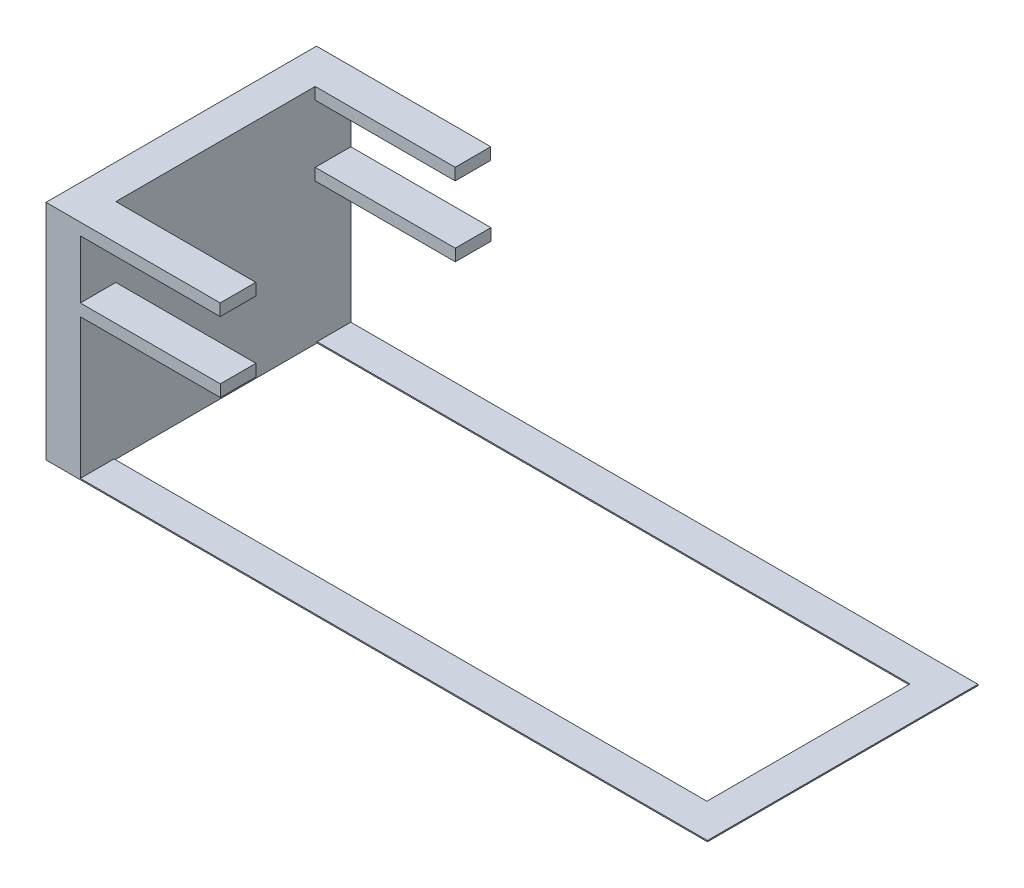
ISO-10303-21;
HEADER;
FILE_DESCRIPTION(('STEP AP214'),'2;1');
FILE_NAME('part.step','',(''),(''),'','','');
FILE_SCHEMA(('AUTOMOTIVE_DESIGN { 1 0 10303 214 1 1 1 1 }'));
ENDSEC;
DATA;
#1=APPLICATION_CONTEXT('core data for automotive mechanical design processes');
#2=APPLICATION_PROTOCOL_DEFINITION('international standard','automotive_design',2000,#1);
#3=PRODUCT_CONTEXT('',#1,'mechanical');
#4=PRODUCT('Part','Part','',(#3));
#5=PRODUCT_RELATED_PRODUCT_CATEGORY('part','',(#4));
#6=PRODUCT_DEFINITION_FORMATION('','',#4);
#7=PRODUCT_DEFINITION_CONTEXT('part definition',#1,'design');
#8=PRODUCT_DEFINITION('design','',#6,#7);
#9=PRODUCT_DEFINITION_SHAPE('','',#8);
#10=(LENGTH_UNIT() NAMED_UNIT(*) SI_UNIT(.MILLI.,.METRE.));
#11=(NAMED_UNIT(*) PLANE_ANGLE_UNIT() SI_UNIT($,.RADIAN.));
#12=(NAMED_UNIT(*) SI_UNIT($,.STERADIAN.) SOLID_ANGLE_UNIT());
#13=UNCERTAINTY_MEASURE_WITH_UNIT(LENGTH_MEASURE(1.E-05),#10,'distance_accuracy_value','');
#14=(GEOMETRIC_REPRESENTATION_CONTEXT(3) GLOBAL_UNCERTAINTY_ASSIGNED_CONTEXT((#13)) GLOBAL_UNIT_ASSIGNED_CONTEXT((#10,
#11,#12)) REPRESENTATION_CONTEXT('',''));
#15=CARTESIAN_POINT('',(0.,0.,0.));
#16=DIRECTION('',(0.,0.,1.));
#17=DIRECTION('',(1.,0.,0.));
#18=AXIS2_PLACEMENT_3D('',#15,#16,#17);
#19=CARTESIAN_POINT('',(-635.,2.54,217.499946));
#20=DIRECTION('',(1.,0.,0.));
#21=DIRECTION('',(0.,0.,-1.));
#22=AXIS2_PLACEMENT_3D('',#19,#20,#21);
#23=PLANE('',#22);
#24=DIRECTION('',(0.,0.,-1.));
#25=VECTOR('',#24,1.);
#26=CARTESIAN_POINT('',(-635.,452.539354,-289.739154560903));
#27=LINE('',#26,#25);
#28=CARTESIAN_POINT('',(-635.,452.539354,-213.539154560903));
#29=VERTEX_POINT('',#28);
#30=CARTESIAN_POINT('',(-635.,452.539354,-289.739154560903));
#31=VERTEX_POINT('',#30);
#32=EDGE_CURVE('E227',#29,#31,#27,.T.);
#33=ORIENTED_EDGE('',*,*,#32,.F.);
#34=DIRECTION('',(0.,-1.,0.));
#35=VECTOR('',#34,1.);
#36=CARTESIAN_POINT('',(-635.,477.939354,-213.539154560903));
#37=LINE('',#36,#35);
#38=CARTESIAN_POINT('',(-635.,477.939354,-213.539154560903));
#39=VERTEX_POINT('',#38);
#40=EDGE_CURVE('E470',#39,#29,#37,.T.);
#41=ORIENTED_EDGE('',*,*,#40,.F.);
#42=DIRECTION('',(0.,0.,-1.));
#43=VECTOR('',#42,1.);
#44=CARTESIAN_POINT('',(-635.,477.939354,-289.739154560903));
#45=LINE('',#44,#43);
#46=CARTESIAN_POINT('',(-635.,477.939354,213.539154560903));
#47=VERTEX_POINT('',#46);
#48=EDGE_CURVE('E232',#47,#39,#45,.T.);
#49=ORIENTED_EDGE('',*,*,#48,.F.);
#50=DIRECTION('',(0.,1.,0.));
#51=VECTOR('',#50,1.);
#52=CARTESIAN_POINT('',(-635.,477.939354,213.539154560903));
#53=LINE('',#52,#51);
#54=CARTESIAN_POINT('',(-635.,452.539354,213.539154560903));
#55=VERTEX_POINT('',#54);
#56=EDGE_CURVE('E238',#55,#47,#53,.T.);
#57=ORIENTED_EDGE('',*,*,#56,.F.);
#58=DIRECTION('',(0.,0.,-1.));
#59=VECTOR('',#58,1.);
#60=CARTESIAN_POINT('',(-635.,452.539354,289.739154560903));
#61=LINE('',#60,#59);
#62=CARTESIAN_POINT('',(-635.,452.539354,289.739154560903));
#63=VERTEX_POINT('',#62);
#64=EDGE_CURVE('E234',#63,#55,#61,.T.);
#65=ORIENTED_EDGE('',*,*,#64,.F.);
#66=DIRECTION('',(0.,-1.,0.));
#67=VECTOR('',#66,1.);
#68=CARTESIAN_POINT('',(-635.,477.939354,289.739154560903));
#69=LINE('',#68,#67);
#70=CARTESIAN_POINT('',(-635.,327.9394,289.739154560903));
#71=VERTEX_POINT('',#70);
#72=EDGE_CURVE('E65',#63,#71,#69,.T.);
#73=ORIENTED_EDGE('',*,*,#72,.T.);
#74=DIRECTION('',(0.,0.,-1.));
#75=VECTOR('',#74,1.);
#76=CARTESIAN_POINT('',(-635.,327.9394,-289.739154560903));
#77=LINE('',#76,#75);
#78=CARTESIAN_POINT('',(-635.,327.9394,213.539154560903));
#79=VERTEX_POINT('',#78);
#80=EDGE_CURVE('E50',#71,#79,#77,.T.);
#81=ORIENTED_EDGE('',*,*,#80,.T.);
#82=DIRECTION('',(0.,1.,0.));
#83=VECTOR('',#82,1.);
#84=CARTESIAN_POINT('',(-635.,327.9394,213.539154560903));
#85=LINE('',#84,#83);
#86=CARTESIAN_POINT('',(-635.,302.5394,213.539154560903));
#87=VERTEX_POINT('',#86);
#88=EDGE_CURVE('E324',#87,#79,#85,.T.);
#89=ORIENTED_EDGE('',*,*,#88,.F.);
#90=DIRECTION('',(0.,0.,-1.));
#91=VECTOR('',#90,1.);
#92=CARTESIAN_POINT('',(-635.,302.5394,289.739154560903));
#93=LINE('',#92,#91);
#94=CARTESIAN_POINT('',(-635.,302.5394,289.739154560903));
#95=VERTEX_POINT('',#94);
#96=EDGE_CURVE('E318',#95,#87,#93,.T.);
#97=ORIENTED_EDGE('',*,*,#96,.F.);
#98=DIRECTION('',(0.,-1.,0.));
#99=VECTOR('',#98,1.);
#100=CARTESIAN_POINT('',(-635.,327.9394,289.739154560903));
#101=LINE('',#100,#99);
#102=CARTESIAN_POINT('',(-635.,2.54,289.739154560903));
#103=VERTEX_POINT('',#102);
#104=EDGE_CURVE('E358',#95,#103,#101,.T.);
#105=ORIENTED_EDGE('',*,*,#104,.T.);
#106=DIRECTION('',(0.,0.,1.));
#107=VECTOR('',#106,1.);
#108=CARTESIAN_POINT('',(-635.,2.54,0.));
#109=LINE('',#108,#107);
#110=CARTESIAN_POINT('',(-635.,2.54,217.499946));
#111=VERTEX_POINT('',#110);
#112=EDGE_CURVE('E361',#111,#103,#109,.T.);
#113=ORIENTED_EDGE('',*,*,#112,.F.);
#114=DIRECTION('',(0.,-1.,0.));
#115=VECTOR('',#114,1.);
#116=CARTESIAN_POINT('',(-635.,2.54,217.499946));
#117=LINE('',#116,#115);
#118=CARTESIAN_POINT('',(-635.,0.,217.499946));
#119=VERTEX_POINT('',#118);
#120=EDGE_CURVE('E402',#111,#119,#117,.T.);
#121=ORIENTED_EDGE('',*,*,#120,.T.);
#122=DIRECTION('',(0.,0.,1.));
#123=VECTOR('',#122,1.);
#124=CARTESIAN_POINT('',(-635.,0.,217.499946));
#125=LINE('',#124,#123);
#126=CARTESIAN_POINT('',(-635.,0.,-217.499946));
#127=VERTEX_POINT('',#126);
#128=EDGE_CURVE('E365',#127,#119,#125,.T.);
#129=ORIENTED_EDGE('',*,*,#128,.F.);
#130=DIRECTION('',(0.,-1.,0.));
#131=VECTOR('',#130,1.);
#132=CARTESIAN_POINT('',(-635.,2.54,-217.499946));
#133=LINE('',#132,#131);
#134=CARTESIAN_POINT('',(-635.,2.54,-217.499946));
#135=VERTEX_POINT('',#134);
#136=EDGE_CURVE('E378',#135,#127,#133,.T.);
#137=ORIENTED_EDGE('',*,*,#136,.F.);
#138=CARTESIAN_POINT('',(-635.,2.54,-289.739154560903));
#139=VERTEX_POINT('',#138);
#140=EDGE_CURVE('E362',#139,#135,#109,.T.);
#141=ORIENTED_EDGE('',*,*,#140,.F.);
#142=DIRECTION('',(0.,-1.,0.));
#143=VECTOR('',#142,1.);
#144=CARTESIAN_POINT('',(-635.,327.9394,-289.739154560903));
#145=LINE('',#144,#143);
#146=CARTESIAN_POINT('',(-635.,302.5394,-289.739154560903));
#147=VERTEX_POINT('',#146);
#148=EDGE_CURVE('E355',#147,#139,#145,.T.);
#149=ORIENTED_EDGE('',*,*,#148,.F.);
#150=DIRECTION('',(0.,0.,-1.));
#151=VECTOR('',#150,1.);
#152=CARTESIAN_POINT('',(-635.,302.5394,-289.739154560903));
#153=LINE('',#152,#151);
#154=CARTESIAN_POINT('',(-635.,302.5394,-213.539154560903));
#155=VERTEX_POINT('',#154);
#156=EDGE_CURVE('E292',#155,#147,#153,.T.);
#157=ORIENTED_EDGE('',*,*,#156,.F.);
#158=DIRECTION('',(0.,-1.,0.));
#159=VECTOR('',#158,1.);
#160=CARTESIAN_POINT('',(-635.,327.9394,-213.539154560903));
#161=LINE('',#160,#159);
#162=CARTESIAN_POINT('',(-635.,327.9394,-213.539154560903));
#163=VERTEX_POINT('',#162);
#164=EDGE_CURVE('E286',#163,#155,#161,.T.);
#165=ORIENTED_EDGE('',*,*,#164,.F.);
#166=CARTESIAN_POINT('',(-635.,327.9394,-289.739154560903));
#167=VERTEX_POINT('',#166);
#168=EDGE_CURVE('E11',#163,#167,#77,.T.);
#169=ORIENTED_EDGE('',*,*,#168,.T.);
#170=DIRECTION('',(0.,-1.,0.));
#171=VECTOR('',#170,1.);
#172=CARTESIAN_POINT('',(-635.,477.939354,-289.739154560903));
#173=LINE('',#172,#171);
#174=EDGE_CURVE('E279',#31,#167,#173,.T.);
#175=ORIENTED_EDGE('',*,*,#174,.F.);
#176=EDGE_LOOP('',(#33,#41,#49,#57,#65,#73,#81,#89,#97,#105,#113,#121,#129,#137,#141,#149,#157,
#165,#169,#175));
#177=FACE_BOUND('',#176,.T.);
#178=ADVANCED_FACE('F39',(#177),#23,.T.);
#179=CARTESIAN_POINT('',(0.,327.9394,0.));
#180=DIRECTION('',(0.,1.,0.));
#181=DIRECTION('',(0.,0.,1.));
#182=AXIS2_PLACEMENT_3D('',#179,#180,#181);
#183=PLANE('',#182);
#184=ORIENTED_EDGE('',*,*,#80,.F.);
#185=DIRECTION('',(1.,0.,0.));
#186=VECTOR('',#185,1.);
#187=CARTESIAN_POINT('',(-708.416176204943,327.9394,289.739154560903));
#188=LINE('',#187,#186);
#189=CARTESIAN_POINT('',(-335.0006,327.9394,289.739154560903));
#190=VERTEX_POINT('',#189);
#191=EDGE_CURVE('E349',#71,#190,#188,.T.);
#192=ORIENTED_EDGE('',*,*,#191,.T.);
#193=DIRECTION('',(0.,0.,1.));
#194=VECTOR('',#193,1.);
#195=CARTESIAN_POINT('',(-335.0006,327.9394,289.739154560903));
#196=LINE('',#195,#194);
#197=CARTESIAN_POINT('',(-335.0006,327.9394,213.539154560903));
#198=VERTEX_POINT('',#197);
#199=EDGE_CURVE('E330',#198,#190,#196,.T.);
#200=ORIENTED_EDGE('',*,*,#199,.F.);
#201=DIRECTION('',(-1.,0.,0.));
#202=VECTOR('',#201,1.);
#203=CARTESIAN_POINT('',(-335.0006,327.9394,213.539154560903));
#204=LINE('',#203,#202);
#205=EDGE_CURVE('E334',#198,#79,#204,.T.);
#206=ORIENTED_EDGE('',*,*,#205,.T.);
#207=EDGE_LOOP('',(#184,#192,#200,#206));
#208=FACE_BOUND('',#207,.T.);
#209=ADVANCED_FACE('F526',(#208),#183,.T.);
#210=CARTESIAN_POINT('',(0.,2.54,0.));
#211=DIRECTION('',(0.,1.,0.));
#212=DIRECTION('',(0.,0.,1.));
#213=AXIS2_PLACEMENT_3D('',#210,#211,#212);
#214=PLANE('',#213);
#215=DIRECTION('',(-1.,0.,0.));
#216=VECTOR('',#215,1.);
#217=CARTESIAN_POINT('',(-708.416176204943,2.54,-289.739154560903));
#218=LINE('',#217,#216);
#219=CARTESIAN_POINT('',(708.416176204943,2.54,-289.739154560903));
#220=VERTEX_POINT('',#219);
#221=EDGE_CURVE('E411',#220,#139,#218,.T.);
#222=ORIENTED_EDGE('',*,*,#221,.T.);
#223=ORIENTED_EDGE('',*,*,#140,.T.);
#224=DIRECTION('',(-1.,0.,0.));
#225=VECTOR('',#224,1.);
#226=CARTESIAN_POINT('',(635.,2.54,-217.499946));
#227=LINE('',#226,#225);
#228=CARTESIAN_POINT('',(635.,2.54,-217.499946));
#229=VERTEX_POINT('',#228);
#230=EDGE_CURVE('E374',#229,#135,#227,.T.);
#231=ORIENTED_EDGE('',*,*,#230,.F.);
#232=DIRECTION('',(0.,0.,-1.));
#233=VECTOR('',#232,1.);
#234=CARTESIAN_POINT('',(635.,2.54,217.499946));
#235=LINE('',#234,#233);
#236=CARTESIAN_POINT('',(635.,2.54,217.499946));
#237=VERTEX_POINT('',#236);
#238=EDGE_CURVE('E369',#237,#229,#235,.T.);
#239=ORIENTED_EDGE('',*,*,#238,.F.);
#240=DIRECTION('',(1.,0.,0.));
#241=VECTOR('',#240,1.);
#242=CARTESIAN_POINT('',(635.,2.54,217.499946));
#243=LINE('',#242,#241);
#244=EDGE_CURVE('E366',#111,#237,#243,.T.);
#245=ORIENTED_EDGE('',*,*,#244,.F.);
#246=ORIENTED_EDGE('',*,*,#112,.T.);
#247=DIRECTION('',(1.,0.,0.));
#248=VECTOR('',#247,1.);
#249=CARTESIAN_POINT('',(-708.416176204943,2.54,289.739154560903));
#250=LINE('',#249,#248);
#251=CARTESIAN_POINT('',(708.416176204943,2.54,289.739154560903));
#252=VERTEX_POINT('',#251);
#253=EDGE_CURVE('E416',#103,#252,#250,.T.);
#254=ORIENTED_EDGE('',*,*,#253,.T.);
#255=DIRECTION('',(0.,0.,-1.));
#256=VECTOR('',#255,1.);
#257=CARTESIAN_POINT('',(708.416176204943,2.54,-289.739154560903));
#258=LINE('',#257,#256);
#259=EDGE_CURVE('E407',#252,#220,#258,.T.);
#260=ORIENTED_EDGE('',*,*,#259,.T.);
#261=EDGE_LOOP('',(#222,#223,#231,#239,#245,#246,#254,#260));
#262=FACE_BOUND('',#261,.T.);
#263=ADVANCED_FACE('F496',(#262),#214,.T.);
#264=CARTESIAN_POINT('',(0.,0.,0.));
#265=DIRECTION('',(0.,1.,0.));
#266=DIRECTION('',(0.,0.,1.));
#267=AXIS2_PLACEMENT_3D('',#264,#265,#266);
#268=PLANE('',#267);
#269=DIRECTION('',(-1.,0.,0.));
#270=VECTOR('',#269,1.);
#271=CARTESIAN_POINT('',(635.,0.,-217.499946));
#272=LINE('',#271,#270);
#273=CARTESIAN_POINT('',(635.,0.,-217.499946));
#274=VERTEX_POINT('',#273);
#275=EDGE_CURVE('E370',#274,#127,#272,.T.);
#276=ORIENTED_EDGE('',*,*,#275,.T.);
#277=ORIENTED_EDGE('',*,*,#128,.T.);
#278=DIRECTION('',(1.,0.,0.));
#279=VECTOR('',#278,1.);
#280=CARTESIAN_POINT('',(635.,0.,217.499946));
#281=LINE('',#280,#279);
#282=CARTESIAN_POINT('',(635.,0.,217.499946));
#283=VERTEX_POINT('',#282);
#284=EDGE_CURVE('E382',#119,#283,#281,.T.);
#285=ORIENTED_EDGE('',*,*,#284,.T.);
#286=DIRECTION('',(0.,0.,-1.));
#287=VECTOR('',#286,1.);
#288=CARTESIAN_POINT('',(635.,0.,217.499946));
#289=LINE('',#288,#287);
#290=EDGE_CURVE('E386',#283,#274,#289,.T.);
#291=ORIENTED_EDGE('',*,*,#290,.T.);
#292=EDGE_LOOP('',(#276,#277,#285,#291));
#293=FACE_BOUND('',#292,.T.);
#294=DIRECTION('',(0.,0.,1.));
#295=VECTOR('',#294,1.);
#296=CARTESIAN_POINT('',(-708.416176204943,0.,-289.739154560903));
#297=LINE('',#296,#295);
#298=CARTESIAN_POINT('',(-708.416176204943,0.,-289.739154560903));
#299=VERTEX_POINT('',#298);
#300=CARTESIAN_POINT('',(-708.416176204943,0.,289.739154560903));
#301=VERTEX_POINT('',#300);
#302=EDGE_CURVE('E426',#299,#301,#297,.T.);
#303=ORIENTED_EDGE('',*,*,#302,.F.);
#304=DIRECTION('',(-1.,0.,0.));
#305=VECTOR('',#304,1.);
#306=CARTESIAN_POINT('',(-708.416176204943,0.,-289.739154560903));
#307=LINE('',#306,#305);
#308=CARTESIAN_POINT('',(708.416176204943,0.,-289.739154560903));
#309=VERTEX_POINT('',#308);
#310=EDGE_CURVE('E423',#309,#299,#307,.T.);
#311=ORIENTED_EDGE('',*,*,#310,.F.);
#312=DIRECTION('',(0.,0.,-1.));
#313=VECTOR('',#312,1.);
#314=CARTESIAN_POINT('',(708.416176204943,0.,-289.739154560903));
#315=LINE('',#314,#313);
#316=CARTESIAN_POINT('',(708.416176204943,0.,289.739154560903));
#317=VERTEX_POINT('',#316);
#318=EDGE_CURVE('E406',#317,#309,#315,.T.);
#319=ORIENTED_EDGE('',*,*,#318,.F.);
#320=DIRECTION('',(1.,0.,0.));
#321=VECTOR('',#320,1.);
#322=CARTESIAN_POINT('',(-708.416176204943,0.,289.739154560903));
#323=LINE('',#322,#321);
#324=EDGE_CURVE('E412',#301,#317,#323,.T.);
#325=ORIENTED_EDGE('',*,*,#324,.F.);
#326=EDGE_LOOP('',(#303,#311,#319,#325));
#327=FACE_BOUND('',#326,.T.);
#328=ADVANCED_FACE('F454',(#293,#327),#268,.F.);
#329=CARTESIAN_POINT('',(708.416176204943,2.54,-289.739154560903));
#330=DIRECTION('',(-1.,0.,0.));
#331=DIRECTION('',(0.,0.,1.));
#332=AXIS2_PLACEMENT_3D('',#329,#330,#331);
#333=PLANE('',#332);
#334=ORIENTED_EDGE('',*,*,#318,.T.);
#335=DIRECTION('',(0.,-1.,0.));
#336=VECTOR('',#335,1.);
#337=CARTESIAN_POINT('',(708.416176204943,2.54,-289.739154560903));
#338=LINE('',#337,#336);
#339=EDGE_CURVE('E43',#220,#309,#338,.T.);
#340=ORIENTED_EDGE('',*,*,#339,.F.);
#341=ORIENTED_EDGE('',*,*,#259,.F.);
#342=DIRECTION('',(0.,-1.,0.));
#343=VECTOR('',#342,1.);
#344=CARTESIAN_POINT('',(708.416176204943,2.54,289.739154560903));
#345=LINE('',#344,#343);
#346=EDGE_CURVE('E419',#252,#317,#345,.T.);
#347=ORIENTED_EDGE('',*,*,#346,.T.);
#348=EDGE_LOOP('',(#334,#340,#341,#347));
#349=FACE_BOUND('',#348,.T.);
#350=ADVANCED_FACE('F41',(#349),#333,.F.);
#351=CARTESIAN_POINT('',(-708.416176204943,2.54,-289.739154560903));
#352=DIRECTION('',(0.,0.,1.));
#353=DIRECTION('',(1.,0.,0.));
#354=AXIS2_PLACEMENT_3D('',#351,#352,#353);
#355=PLANE('',#354);
#356=DIRECTION('',(0.,-1.,0.));
#357=VECTOR('',#356,1.);
#358=CARTESIAN_POINT('',(-708.416176204943,2.54,-289.739154560903));
#359=LINE('',#358,#357);
#360=CARTESIAN_POINT('',(-708.416176204943,477.939354,-289.739154560903));
#361=VERTEX_POINT('',#360);
#362=EDGE_CURVE('E437',#361,#299,#359,.T.);
#363=ORIENTED_EDGE('',*,*,#362,.F.);
#364=DIRECTION('',(-1.,0.,0.));
#365=VECTOR('',#364,1.);
#366=CARTESIAN_POINT('',(-708.416176204943,477.939354,-289.739154560903));
#367=LINE('',#366,#365);
#368=CARTESIAN_POINT('',(-335.28,477.939354,-289.739154560903));
#369=VERTEX_POINT('',#368);
#370=EDGE_CURVE('E277',#369,#361,#367,.T.);
#371=ORIENTED_EDGE('',*,*,#370,.F.);
#372=DIRECTION('',(0.,1.,0.));
#373=VECTOR('',#372,1.);
#374=CARTESIAN_POINT('',(-335.28,477.939354,-289.739154560903));
#375=LINE('',#374,#373);
#376=CARTESIAN_POINT('',(-335.28,452.539354,-289.739154560903));
#377=VERTEX_POINT('',#376);
#378=EDGE_CURVE('E224',#377,#369,#375,.T.);
#379=ORIENTED_EDGE('',*,*,#378,.F.);
#380=DIRECTION('',(-1.,0.,0.));
#381=VECTOR('',#380,1.);
#382=CARTESIAN_POINT('',(-335.28,452.539354,-289.739154560903));
#383=LINE('',#382,#381);
#384=EDGE_CURVE('E240',#377,#31,#383,.T.);
#385=ORIENTED_EDGE('',*,*,#384,.T.);
#386=ORIENTED_EDGE('',*,*,#174,.T.);
#387=DIRECTION('',(1.,0.,0.));
#388=VECTOR('',#387,1.);
#389=CARTESIAN_POINT('',(-708.416176204943,327.9394,-289.739154560903));
#390=LINE('',#389,#388);
#391=CARTESIAN_POINT('',(-335.0006,327.9394,-289.739154560903));
#392=VERTEX_POINT('',#391);
#393=EDGE_CURVE('E352',#167,#392,#390,.T.);
#394=ORIENTED_EDGE('',*,*,#393,.T.);
#395=DIRECTION('',(0.,1.,0.));
#396=VECTOR('',#395,1.);
#397=CARTESIAN_POINT('',(-335.0006,327.9394,-289.739154560903));
#398=LINE('',#397,#396);
#399=CARTESIAN_POINT('',(-335.0006,302.5394,-289.739154560903));
#400=VERTEX_POINT('',#399);
#401=EDGE_CURVE('E298',#400,#392,#398,.T.);
#402=ORIENTED_EDGE('',*,*,#401,.F.);
#403=DIRECTION('',(-1.,0.,0.));
#404=VECTOR('',#403,1.);
#405=CARTESIAN_POINT('',(-335.0006,302.5394,-289.739154560903));
#406=LINE('',#405,#404);
#407=EDGE_CURVE('E302',#400,#147,#406,.T.);
#408=ORIENTED_EDGE('',*,*,#407,.T.);
#409=ORIENTED_EDGE('',*,*,#148,.T.);
#410=ORIENTED_EDGE('',*,*,#221,.F.);
#411=ORIENTED_EDGE('',*,*,#339,.T.);
#412=ORIENTED_EDGE('',*,*,#310,.T.);
#413=EDGE_LOOP('',(#363,#371,#379,#385,#386,#394,#402,#408,#409,#410,#411,#412));
#414=FACE_BOUND('',#413,.T.);
#415=ADVANCED_FACE('F447',(#414),#355,.F.);
#416=CARTESIAN_POINT('',(-708.416176204943,2.54,-289.739154560903));
#417=DIRECTION('',(1.,0.,0.));
#418=DIRECTION('',(0.,0.,-1.));
#419=AXIS2_PLACEMENT_3D('',#416,#417,#418);
#420=PLANE('',#419);
#421=ORIENTED_EDGE('',*,*,#302,.T.);
#422=DIRECTION('',(0.,-1.,0.));
#423=VECTOR('',#422,1.);
#424=CARTESIAN_POINT('',(-708.416176204943,2.54,289.739154560903));
#425=LINE('',#424,#423);
#426=CARTESIAN_POINT('',(-708.416176204943,477.939354,289.739154560903));
#427=VERTEX_POINT('',#426);
#428=EDGE_CURVE('E434',#427,#301,#425,.T.);
#429=ORIENTED_EDGE('',*,*,#428,.F.);
#430=DIRECTION('',(0.,0.,1.));
#431=VECTOR('',#430,1.);
#432=CARTESIAN_POINT('',(-708.416176204943,477.939354,-289.739154560903));
#433=LINE('',#432,#431);
#434=EDGE_CURVE('E269',#361,#427,#433,.T.);
#435=ORIENTED_EDGE('',*,*,#434,.F.);
#436=ORIENTED_EDGE('',*,*,#362,.T.);
#437=EDGE_LOOP('',(#421,#429,#435,#436));
#438=FACE_BOUND('',#437,.T.);
#439=ADVANCED_FACE('F455',(#438),#420,.F.);
#440=CARTESIAN_POINT('',(-708.416176204943,2.54,289.739154560903));
#441=DIRECTION('',(0.,0.,-1.));
#442=DIRECTION('',(-1.,0.,0.));
#443=AXIS2_PLACEMENT_3D('',#440,#441,#442);
#444=PLANE('',#443);
#445=ORIENTED_EDGE('',*,*,#324,.T.);
#446=ORIENTED_EDGE('',*,*,#346,.F.);
#447=ORIENTED_EDGE('',*,*,#253,.F.);
#448=ORIENTED_EDGE('',*,*,#104,.F.);
#449=DIRECTION('',(-1.,0.,0.));
#450=VECTOR('',#449,1.);
#451=CARTESIAN_POINT('',(-335.0006,302.5394,289.739154560903));
#452=LINE('',#451,#450);
#453=CARTESIAN_POINT('',(-335.0006,302.5394,289.739154560903));
#454=VERTEX_POINT('',#453);
#455=EDGE_CURVE('E346',#454,#95,#452,.T.);
#456=ORIENTED_EDGE('',*,*,#455,.F.);
#457=DIRECTION('',(0.,-1.,0.));
#458=VECTOR('',#457,1.);
#459=CARTESIAN_POINT('',(-335.0006,327.9394,289.739154560903));
#460=LINE('',#459,#458);
#461=EDGE_CURVE('E319',#190,#454,#460,.T.);
#462=ORIENTED_EDGE('',*,*,#461,.F.);
#463=ORIENTED_EDGE('',*,*,#191,.F.);
#464=ORIENTED_EDGE('',*,*,#72,.F.);
#465=DIRECTION('',(-1.,0.,0.));
#466=VECTOR('',#465,1.);
#467=CARTESIAN_POINT('',(-335.28,452.539354,289.739154560903));
#468=LINE('',#467,#466);
#469=CARTESIAN_POINT('',(-335.28,452.539354,289.739154560903));
#470=VERTEX_POINT('',#469);
#471=EDGE_CURVE('E266',#470,#63,#468,.T.);
#472=ORIENTED_EDGE('',*,*,#471,.F.);
#473=DIRECTION('',(0.,-1.,0.));
#474=VECTOR('',#473,1.);
#475=CARTESIAN_POINT('',(-335.28,477.939354,289.739154560903));
#476=LINE('',#475,#474);
#477=CARTESIAN_POINT('',(-335.28,477.939354,289.739154560903));
#478=VERTEX_POINT('',#477);
#479=EDGE_CURVE('E244',#478,#470,#476,.T.);
#480=ORIENTED_EDGE('',*,*,#479,.F.);
#481=DIRECTION('',(1.,0.,0.));
#482=VECTOR('',#481,1.);
#483=CARTESIAN_POINT('',(-708.416176204943,477.939354,289.739154560903));
#484=LINE('',#483,#482);
#485=EDGE_CURVE('E272',#427,#478,#484,.T.);
#486=ORIENTED_EDGE('',*,*,#485,.F.);
#487=ORIENTED_EDGE('',*,*,#428,.T.);
#488=EDGE_LOOP('',(#445,#446,#447,#448,#456,#462,#463,#464,#472,#480,#486,#487));
#489=FACE_BOUND('',#488,.T.);
#490=ADVANCED_FACE('F458',(#489),#444,.F.);
#491=CARTESIAN_POINT('',(635.,2.54,217.499946));
#492=DIRECTION('',(0.,0.,-1.));
#493=DIRECTION('',(-1.,0.,0.));
#494=AXIS2_PLACEMENT_3D('',#491,#492,#493);
#495=PLANE('',#494);
#496=ORIENTED_EDGE('',*,*,#284,.F.);
#497=ORIENTED_EDGE('',*,*,#120,.F.);
#498=ORIENTED_EDGE('',*,*,#244,.T.);
#499=DIRECTION('',(0.,-1.,0.));
#500=VECTOR('',#499,1.);
#501=CARTESIAN_POINT('',(635.,2.54,217.499946));
#502=LINE('',#501,#500);
#503=EDGE_CURVE('E399',#237,#283,#502,.T.);
#504=ORIENTED_EDGE('',*,*,#503,.T.);
#505=EDGE_LOOP('',(#496,#497,#498,#504));
#506=FACE_BOUND('',#505,.T.);
#507=ADVANCED_FACE('F552',(#506),#495,.T.);
#508=CARTESIAN_POINT('',(635.,2.54,217.499946));
#509=DIRECTION('',(-1.,0.,0.));
#510=DIRECTION('',(0.,0.,1.));
#511=AXIS2_PLACEMENT_3D('',#508,#509,#510);
#512=PLANE('',#511);
#513=ORIENTED_EDGE('',*,*,#290,.F.);
#514=ORIENTED_EDGE('',*,*,#503,.F.);
#515=ORIENTED_EDGE('',*,*,#238,.T.);
#516=DIRECTION('',(0.,-1.,0.));
#517=VECTOR('',#516,1.);
#518=CARTESIAN_POINT('',(635.,2.54,-217.499946));
#519=LINE('',#518,#517);
#520=EDGE_CURVE('E396',#229,#274,#519,.T.);
#521=ORIENTED_EDGE('',*,*,#520,.T.);
#522=EDGE_LOOP('',(#513,#514,#515,#521));
#523=FACE_BOUND('',#522,.T.);
#524=ADVANCED_FACE('F504',(#523),#512,.T.);
#525=CARTESIAN_POINT('',(635.,2.54,-217.499946));
#526=DIRECTION('',(0.,0.,1.));
#527=DIRECTION('',(1.,0.,0.));
#528=AXIS2_PLACEMENT_3D('',#525,#526,#527);
#529=PLANE('',#528);
#530=ORIENTED_EDGE('',*,*,#275,.F.);
#531=ORIENTED_EDGE('',*,*,#520,.F.);
#532=ORIENTED_EDGE('',*,*,#230,.T.);
#533=ORIENTED_EDGE('',*,*,#136,.T.);
#534=EDGE_LOOP('',(#530,#531,#532,#533));
#535=FACE_BOUND('',#534,.T.);
#536=ADVANCED_FACE('F500',(#535),#529,.T.);
#537=ORIENTED_EDGE('',*,*,#168,.F.);
#538=DIRECTION('',(-1.,0.,0.));
#539=VECTOR('',#538,1.);
#540=CARTESIAN_POINT('',(-335.0006,327.9394,-213.539154560903));
#541=LINE('',#540,#539);
#542=CARTESIAN_POINT('',(-335.0006,327.9394,-213.539154560903));
#543=VERTEX_POINT('',#542);
#544=EDGE_CURVE('E314',#543,#163,#541,.T.);
#545=ORIENTED_EDGE('',*,*,#544,.F.);
#546=DIRECTION('',(0.,0.,1.));
#547=VECTOR('',#546,1.);
#548=CARTESIAN_POINT('',(-335.0006,327.9394,-289.739154560903));
#549=LINE('',#548,#547);
#550=EDGE_CURVE('E287',#392,#543,#549,.T.);
#551=ORIENTED_EDGE('',*,*,#550,.F.);
#552=ORIENTED_EDGE('',*,*,#393,.F.);
#553=EDGE_LOOP('',(#537,#545,#551,#552));
#554=FACE_BOUND('',#553,.T.);
#555=ADVANCED_FACE('F482',(#554),#183,.T.);
#556=CARTESIAN_POINT('',(-335.0006,302.5394,289.739154560903));
#557=DIRECTION('',(0.,1.,0.));
#558=DIRECTION('',(0.,0.,1.));
#559=AXIS2_PLACEMENT_3D('',#556,#557,#558);
#560=PLANE('',#559);
#561=ORIENTED_EDGE('',*,*,#96,.T.);
#562=DIRECTION('',(-1.,0.,0.));
#563=VECTOR('',#562,1.);
#564=CARTESIAN_POINT('',(-335.0006,302.5394,213.539154560903));
#565=LINE('',#564,#563);
#566=CARTESIAN_POINT('',(-335.0006,302.5394,213.539154560903));
#567=VERTEX_POINT('',#566);
#568=EDGE_CURVE('E342',#567,#87,#565,.T.);
#569=ORIENTED_EDGE('',*,*,#568,.F.);
#570=DIRECTION('',(0.,0.,-1.));
#571=VECTOR('',#570,1.);
#572=CARTESIAN_POINT('',(-335.0006,302.5394,289.739154560903));
#573=LINE('',#572,#571);
#574=EDGE_CURVE('E323',#454,#567,#573,.T.);
#575=ORIENTED_EDGE('',*,*,#574,.F.);
#576=ORIENTED_EDGE('',*,*,#455,.T.);
#577=EDGE_LOOP('',(#561,#569,#575,#576));
#578=FACE_BOUND('',#577,.T.);
#579=ADVANCED_FACE('F518',(#578),#560,.F.);
#580=CARTESIAN_POINT('',(-335.0006,327.9394,213.539154560903));
#581=DIRECTION('',(0.,0.,1.));
#582=DIRECTION('',(1.,0.,0.));
#583=AXIS2_PLACEMENT_3D('',#580,#581,#582);
#584=PLANE('',#583);
#585=ORIENTED_EDGE('',*,*,#88,.T.);
#586=ORIENTED_EDGE('',*,*,#205,.F.);
#587=DIRECTION('',(0.,1.,0.));
#588=VECTOR('',#587,1.);
#589=CARTESIAN_POINT('',(-335.0006,327.9394,213.539154560903));
#590=LINE('',#589,#588);
#591=EDGE_CURVE('E327',#567,#198,#590,.T.);
#592=ORIENTED_EDGE('',*,*,#591,.F.);
#593=ORIENTED_EDGE('',*,*,#568,.T.);
#594=EDGE_LOOP('',(#585,#586,#592,#593));
#595=FACE_BOUND('',#594,.T.);
#596=ADVANCED_FACE('F613',(#595),#584,.F.);
#597=CARTESIAN_POINT('',(-335.0006,0.,0.));
#598=DIRECTION('',(1.,0.,0.));
#599=DIRECTION('',(0.,0.,-1.));
#600=AXIS2_PLACEMENT_3D('',#597,#598,#599);
#601=PLANE('',#600);
#602=ORIENTED_EDGE('',*,*,#461,.T.);
#603=ORIENTED_EDGE('',*,*,#574,.T.);
#604=ORIENTED_EDGE('',*,*,#591,.T.);
#605=ORIENTED_EDGE('',*,*,#199,.T.);
#606=EDGE_LOOP('',(#602,#603,#604,#605));
#607=FACE_BOUND('',#606,.T.);
#608=ADVANCED_FACE('F522',(#607),#601,.T.);
#609=CARTESIAN_POINT('',(-335.0006,327.9394,-213.539154560903));
#610=DIRECTION('',(0.,0.,-1.));
#611=DIRECTION('',(-1.,0.,0.));
#612=AXIS2_PLACEMENT_3D('',#609,#610,#611);
#613=PLANE('',#612);
#614=ORIENTED_EDGE('',*,*,#164,.T.);
#615=DIRECTION('',(-1.,0.,0.));
#616=VECTOR('',#615,1.);
#617=CARTESIAN_POINT('',(-335.0006,302.5394,-213.539154560903));
#618=LINE('',#617,#616);
#619=CARTESIAN_POINT('',(-335.0006,302.5394,-213.539154560903));
#620=VERTEX_POINT('',#619);
#621=EDGE_CURVE('E310',#620,#155,#618,.T.);
#622=ORIENTED_EDGE('',*,*,#621,.F.);
#623=DIRECTION('',(0.,-1.,0.));
#624=VECTOR('',#623,1.);
#625=CARTESIAN_POINT('',(-335.0006,327.9394,-213.539154560903));
#626=LINE('',#625,#624);
#627=EDGE_CURVE('E291',#543,#620,#626,.T.);
#628=ORIENTED_EDGE('',*,*,#627,.F.);
#629=ORIENTED_EDGE('',*,*,#544,.T.);
#630=EDGE_LOOP('',(#614,#622,#628,#629));
#631=FACE_BOUND('',#630,.T.);
#632=ADVANCED_FACE('F625',(#631),#613,.F.);
#633=CARTESIAN_POINT('',(-335.0006,302.5394,-289.739154560903));
#634=DIRECTION('',(0.,1.,0.));
#635=DIRECTION('',(0.,0.,1.));
#636=AXIS2_PLACEMENT_3D('',#633,#634,#635);
#637=PLANE('',#636);
#638=ORIENTED_EDGE('',*,*,#156,.T.);
#639=ORIENTED_EDGE('',*,*,#407,.F.);
#640=DIRECTION('',(0.,0.,-1.));
#641=VECTOR('',#640,1.);
#642=CARTESIAN_POINT('',(-335.0006,302.5394,-289.739154560903));
#643=LINE('',#642,#641);
#644=EDGE_CURVE('E295',#620,#400,#643,.T.);
#645=ORIENTED_EDGE('',*,*,#644,.F.);
#646=ORIENTED_EDGE('',*,*,#621,.T.);
#647=EDGE_LOOP('',(#638,#639,#645,#646));
#648=FACE_BOUND('',#647,.T.);
#649=ADVANCED_FACE('F629',(#648),#637,.F.);
#650=CARTESIAN_POINT('',(-335.0006,0.,0.));
#651=DIRECTION('',(1.,0.,0.));
#652=DIRECTION('',(0.,0.,-1.));
#653=AXIS2_PLACEMENT_3D('',#650,#651,#652);
#654=PLANE('',#653);
#655=ORIENTED_EDGE('',*,*,#550,.T.);
#656=ORIENTED_EDGE('',*,*,#627,.T.);
#657=ORIENTED_EDGE('',*,*,#644,.T.);
#658=ORIENTED_EDGE('',*,*,#401,.T.);
#659=EDGE_LOOP('',(#655,#656,#657,#658));
#660=FACE_BOUND('',#659,.T.);
#661=ADVANCED_FACE('F485',(#660),#654,.T.);
#662=CARTESIAN_POINT('',(0.,477.939354,0.));
#663=DIRECTION('',(0.,1.,0.));
#664=DIRECTION('',(0.,0.,1.));
#665=AXIS2_PLACEMENT_3D('',#662,#663,#664);
#666=PLANE('',#665);
#667=ORIENTED_EDGE('',*,*,#434,.T.);
#668=ORIENTED_EDGE('',*,*,#485,.T.);
#669=DIRECTION('',(0.,0.,1.));
#670=VECTOR('',#669,1.);
#671=CARTESIAN_POINT('',(-335.28,477.939354,289.739154560903));
#672=LINE('',#671,#670);
#673=CARTESIAN_POINT('',(-335.28,477.939354,213.539154560903));
#674=VERTEX_POINT('',#673);
#675=EDGE_CURVE('E254',#674,#478,#672,.T.);
#676=ORIENTED_EDGE('',*,*,#675,.F.);
#677=DIRECTION('',(-1.,0.,0.));
#678=VECTOR('',#677,1.);
#679=CARTESIAN_POINT('',(-335.28,477.939354,213.539154560903));
#680=LINE('',#679,#678);
#681=EDGE_CURVE('E57',#674,#47,#680,.T.);
#682=ORIENTED_EDGE('',*,*,#681,.T.);
#683=ORIENTED_EDGE('',*,*,#48,.T.);
#684=DIRECTION('',(-1.,0.,0.));
#685=VECTOR('',#684,1.);
#686=CARTESIAN_POINT('',(-335.28,477.939354,-213.539154560903));
#687=LINE('',#686,#685);
#688=CARTESIAN_POINT('',(-335.28,477.939354,-213.539154560903));
#689=VERTEX_POINT('',#688);
#690=EDGE_CURVE('E210',#689,#39,#687,.T.);
#691=ORIENTED_EDGE('',*,*,#690,.F.);
#692=DIRECTION('',(0.,0.,1.));
#693=VECTOR('',#692,1.);
#694=CARTESIAN_POINT('',(-335.28,477.939354,-289.739154560903));
#695=LINE('',#694,#693);
#696=EDGE_CURVE('E218',#369,#689,#695,.T.);
#697=ORIENTED_EDGE('',*,*,#696,.F.);
#698=ORIENTED_EDGE('',*,*,#370,.T.);
#699=EDGE_LOOP('',(#667,#668,#676,#682,#683,#691,#697,#698));
#700=FACE_BOUND('',#699,.T.);
#701=ADVANCED_FACE('F230',(#700),#666,.T.);
#702=CARTESIAN_POINT('',(-335.28,452.539354,289.739154560903));
#703=DIRECTION('',(0.,1.,0.));
#704=DIRECTION('',(0.,0.,1.));
#705=AXIS2_PLACEMENT_3D('',#702,#703,#704);
#706=PLANE('',#705);
#707=ORIENTED_EDGE('',*,*,#64,.T.);
#708=DIRECTION('',(-1.,0.,0.));
#709=VECTOR('',#708,1.);
#710=CARTESIAN_POINT('',(-335.28,452.539354,213.539154560903));
#711=LINE('',#710,#709);
#712=CARTESIAN_POINT('',(-335.28,452.539354,213.539154560903));
#713=VERTEX_POINT('',#712);
#714=EDGE_CURVE('E262',#713,#55,#711,.T.);
#715=ORIENTED_EDGE('',*,*,#714,.F.);
#716=DIRECTION('',(0.,0.,-1.));
#717=VECTOR('',#716,1.);
#718=CARTESIAN_POINT('',(-335.28,452.539354,289.739154560903));
#719=LINE('',#718,#717);
#720=EDGE_CURVE('E248',#470,#713,#719,.T.);
#721=ORIENTED_EDGE('',*,*,#720,.F.);
#722=ORIENTED_EDGE('',*,*,#471,.T.);
#723=EDGE_LOOP('',(#707,#715,#721,#722));
#724=FACE_BOUND('',#723,.T.);
#725=ADVANCED_FACE('F528',(#724),#706,.F.);
#726=CARTESIAN_POINT('',(-335.28,477.939354,213.539154560903));
#727=DIRECTION('',(0.,0.,1.));
#728=DIRECTION('',(1.,0.,0.));
#729=AXIS2_PLACEMENT_3D('',#726,#727,#728);
#730=PLANE('',#729);
#731=ORIENTED_EDGE('',*,*,#56,.T.);
#732=ORIENTED_EDGE('',*,*,#681,.F.);
#733=DIRECTION('',(0.,1.,0.));
#734=VECTOR('',#733,1.);
#735=CARTESIAN_POINT('',(-335.28,477.939354,213.539154560903));
#736=LINE('',#735,#734);
#737=EDGE_CURVE('E251',#713,#674,#736,.T.);
#738=ORIENTED_EDGE('',*,*,#737,.F.);
#739=ORIENTED_EDGE('',*,*,#714,.T.);
#740=EDGE_LOOP('',(#731,#732,#738,#739));
#741=FACE_BOUND('',#740,.T.);
#742=ADVANCED_FACE('F532',(#741),#730,.F.);
#743=CARTESIAN_POINT('',(-335.28,0.,0.));
#744=DIRECTION('',(1.,0.,0.));
#745=DIRECTION('',(0.,0.,-1.));
#746=AXIS2_PLACEMENT_3D('',#743,#744,#745);
#747=PLANE('',#746);
#748=ORIENTED_EDGE('',*,*,#479,.T.);
#749=ORIENTED_EDGE('',*,*,#720,.T.);
#750=ORIENTED_EDGE('',*,*,#737,.T.);
#751=ORIENTED_EDGE('',*,*,#675,.T.);
#752=EDGE_LOOP('',(#748,#749,#750,#751));
#753=FACE_BOUND('',#752,.T.);
#754=ADVANCED_FACE('F535',(#753),#747,.T.);
#755=CARTESIAN_POINT('',(-335.28,477.939354,-213.539154560903));
#756=DIRECTION('',(0.,0.,-1.));
#757=DIRECTION('',(-1.,0.,0.));
#758=AXIS2_PLACEMENT_3D('',#755,#756,#757);
#759=PLANE('',#758);
#760=ORIENTED_EDGE('',*,*,#40,.T.);
#761=DIRECTION('',(-1.,0.,0.));
#762=VECTOR('',#761,1.);
#763=CARTESIAN_POINT('',(-335.28,452.539354,-213.539154560903));
#764=LINE('',#763,#762);
#765=CARTESIAN_POINT('',(-335.28,452.539354,-213.539154560903));
#766=VERTEX_POINT('',#765);
#767=EDGE_CURVE('E213',#766,#29,#764,.T.);
#768=ORIENTED_EDGE('',*,*,#767,.F.);
#769=DIRECTION('',(0.,-1.,0.));
#770=VECTOR('',#769,1.);
#771=CARTESIAN_POINT('',(-335.28,477.939354,-213.539154560903));
#772=LINE('',#771,#770);
#773=EDGE_CURVE('E206',#689,#766,#772,.T.);
#774=ORIENTED_EDGE('',*,*,#773,.F.);
#775=ORIENTED_EDGE('',*,*,#690,.T.);
#776=EDGE_LOOP('',(#760,#768,#774,#775));
#777=FACE_BOUND('',#776,.T.);
#778=ADVANCED_FACE('F208',(#777),#759,.F.);
#779=CARTESIAN_POINT('',(-335.28,452.539354,-289.739154560903));
#780=DIRECTION('',(0.,1.,0.));
#781=DIRECTION('',(0.,0.,1.));
#782=AXIS2_PLACEMENT_3D('',#779,#780,#781);
#783=PLANE('',#782);
#784=ORIENTED_EDGE('',*,*,#32,.T.);
#785=ORIENTED_EDGE('',*,*,#384,.F.);
#786=DIRECTION('',(0.,0.,-1.));
#787=VECTOR('',#786,1.);
#788=CARTESIAN_POINT('',(-335.28,452.539354,-289.739154560903));
#789=LINE('',#788,#787);
#790=EDGE_CURVE('E217',#766,#377,#789,.T.);
#791=ORIENTED_EDGE('',*,*,#790,.F.);
#792=ORIENTED_EDGE('',*,*,#767,.T.);
#793=EDGE_LOOP('',(#784,#785,#791,#792));
#794=FACE_BOUND('',#793,.T.);
#795=ADVANCED_FACE('F476',(#794),#783,.F.);
#796=CARTESIAN_POINT('',(-335.28,0.,0.));
#797=DIRECTION('',(1.,0.,0.));
#798=DIRECTION('',(0.,0.,-1.));
#799=AXIS2_PLACEMENT_3D('',#796,#797,#798);
#800=PLANE('',#799);
#801=ORIENTED_EDGE('',*,*,#696,.T.);
#802=ORIENTED_EDGE('',*,*,#773,.T.);
#803=ORIENTED_EDGE('',*,*,#790,.T.);
#804=ORIENTED_EDGE('',*,*,#378,.T.);
#805=EDGE_LOOP('',(#801,#802,#803,#804));
#806=FACE_BOUND('',#805,.T.);
#807=ADVANCED_FACE('F222',(#806),#800,.T.);
#808=CLOSED_SHELL('',(#178,#209,#263,#328,#350,#415,#439,#490,#507,#524,#536,#555,#579,#596,
#608,#632,#649,#661,#701,#725,#742,#754,#778,#795,#807));
#809=MANIFOLD_SOLID_BREP('B2',#808);
#810=ADVANCED_BREP_SHAPE_REPRESENTATION('',(#18,#809),#14);
#811=SHAPE_DEFINITION_REPRESENTATION(#9,#810);
ENDSEC;
END-ISO-10303-21;
